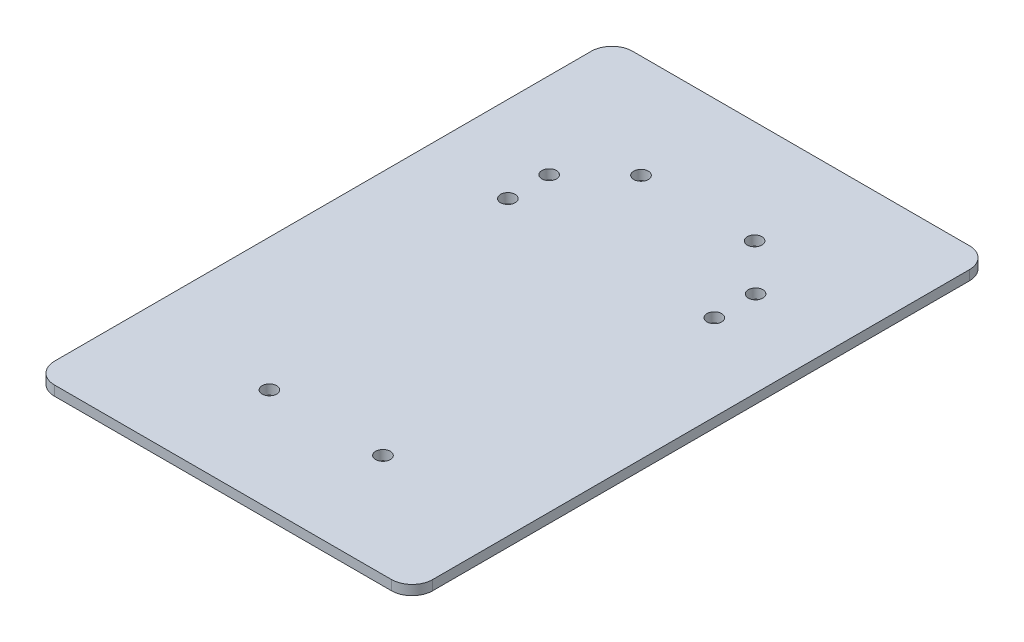
ISO-10303-21;
HEADER;
FILE_DESCRIPTION(('STEP AP214'),'2;1');
FILE_NAME('part.step','',(''),(''),'','','');
FILE_SCHEMA(('AUTOMOTIVE_DESIGN { 1 0 10303 214 1 1 1 1 }'));
ENDSEC;
DATA;
#1=APPLICATION_CONTEXT('core data for automotive mechanical design processes');
#2=APPLICATION_PROTOCOL_DEFINITION('international standard','automotive_design',2000,#1);
#3=PRODUCT_CONTEXT('',#1,'mechanical');
#4=PRODUCT('Part','Part','',(#3));
#5=PRODUCT_RELATED_PRODUCT_CATEGORY('part','',(#4));
#6=PRODUCT_DEFINITION_FORMATION('','',#4);
#7=PRODUCT_DEFINITION_CONTEXT('part definition',#1,'design');
#8=PRODUCT_DEFINITION('design','',#6,#7);
#9=PRODUCT_DEFINITION_SHAPE('','',#8);
#10=(LENGTH_UNIT() NAMED_UNIT(*) SI_UNIT(.MILLI.,.METRE.));
#11=(NAMED_UNIT(*) PLANE_ANGLE_UNIT() SI_UNIT($,.RADIAN.));
#12=(NAMED_UNIT(*) SI_UNIT($,.STERADIAN.) SOLID_ANGLE_UNIT());
#13=UNCERTAINTY_MEASURE_WITH_UNIT(LENGTH_MEASURE(1.E-05),#10,'distance_accuracy_value','');
#14=(GEOMETRIC_REPRESENTATION_CONTEXT(3) GLOBAL_UNCERTAINTY_ASSIGNED_CONTEXT((#13)) GLOBAL_UNIT_ASSIGNED_CONTEXT((#10,
#11,#12)) REPRESENTATION_CONTEXT('',''));
#15=CARTESIAN_POINT('',(0.,0.,0.));
#16=DIRECTION('',(0.,0.,1.));
#17=DIRECTION('',(1.,0.,0.));
#18=AXIS2_PLACEMENT_3D('',#15,#16,#17);
#19=CARTESIAN_POINT('',(0.,3.,0.));
#20=DIRECTION('',(0.,0.,-1.));
#21=DIRECTION('',(-1.,0.,0.));
#22=AXIS2_PLACEMENT_3D('',#19,#20,#21);
#23=PLANE('',#22);
#24=DIRECTION('',(1.,0.,0.));
#25=VECTOR('',#24,1.);
#26=CARTESIAN_POINT('',(0.,3.,0.));
#27=LINE('',#26,#25);
#28=CARTESIAN_POINT('',(6.35,3.,0.));
#29=VERTEX_POINT('',#28);
#30=CARTESIAN_POINT('',(109.982,3.,0.));
#31=VERTEX_POINT('',#30);
#32=EDGE_CURVE('E170',#29,#31,#27,.T.);
#33=ORIENTED_EDGE('',*,*,#32,.T.);
#34=DIRECTION('',(0.,-1.,0.));
#35=VECTOR('',#34,1.);
#36=CARTESIAN_POINT('',(109.982,0.,0.));
#37=LINE('',#36,#35);
#38=CARTESIAN_POINT('',(109.982,0.,0.));
#39=VERTEX_POINT('',#38);
#40=EDGE_CURVE('E12',#31,#39,#37,.T.);
#41=ORIENTED_EDGE('',*,*,#40,.T.);
#42=DIRECTION('',(1.,0.,0.));
#43=VECTOR('',#42,1.);
#44=CARTESIAN_POINT('',(0.,0.,0.));
#45=LINE('',#44,#43);
#46=CARTESIAN_POINT('',(6.35,0.,0.));
#47=VERTEX_POINT('',#46);
#48=EDGE_CURVE('E172',#47,#39,#45,.T.);
#49=ORIENTED_EDGE('',*,*,#48,.F.);
#50=DIRECTION('',(0.,-1.,0.));
#51=VECTOR('',#50,1.);
#52=CARTESIAN_POINT('',(6.35,3.,0.));
#53=LINE('',#52,#51);
#54=EDGE_CURVE('E83',#47,#29,#53,.F.);
#55=ORIENTED_EDGE('',*,*,#54,.T.);
#56=EDGE_LOOP('',(#33,#41,#49,#55));
#57=FACE_BOUND('',#56,.T.);
#58=ADVANCED_FACE('F75',(#57),#23,.T.);
#59=CARTESIAN_POINT('',(0.,3.,0.));
#60=DIRECTION('',(1.,0.,0.));
#61=DIRECTION('',(0.,0.,-1.));
#62=AXIS2_PLACEMENT_3D('',#59,#60,#61);
#63=PLANE('',#62);
#64=DIRECTION('',(0.,0.,1.));
#65=VECTOR('',#64,1.);
#66=CARTESIAN_POINT('',(0.,0.,0.));
#67=LINE('',#66,#65);
#68=CARTESIAN_POINT('',(0.,0.,6.35));
#69=VERTEX_POINT('',#68);
#70=CARTESIAN_POINT('',(0.,0.,171.45));
#71=VERTEX_POINT('',#70);
#72=EDGE_CURVE('E168',#69,#71,#67,.T.);
#73=ORIENTED_EDGE('',*,*,#72,.T.);
#74=DIRECTION('',(0.,-1.,0.));
#75=VECTOR('',#74,1.);
#76=CARTESIAN_POINT('',(0.,3.,171.45));
#77=LINE('',#76,#75);
#78=CARTESIAN_POINT('',(0.,3.,171.45));
#79=VERTEX_POINT('',#78);
#80=EDGE_CURVE('E147',#71,#79,#77,.F.);
#81=ORIENTED_EDGE('',*,*,#80,.T.);
#82=DIRECTION('',(0.,0.,1.));
#83=VECTOR('',#82,1.);
#84=CARTESIAN_POINT('',(0.,3.,0.));
#85=LINE('',#84,#83);
#86=CARTESIAN_POINT('',(0.,3.,6.35));
#87=VERTEX_POINT('',#86);
#88=EDGE_CURVE('E221',#87,#79,#85,.T.);
#89=ORIENTED_EDGE('',*,*,#88,.F.);
#90=DIRECTION('',(0.,-1.,0.));
#91=VECTOR('',#90,1.);
#92=CARTESIAN_POINT('',(0.,0.,6.35));
#93=LINE('',#92,#91);
#94=EDGE_CURVE('E152',#87,#69,#93,.T.);
#95=ORIENTED_EDGE('',*,*,#94,.T.);
#96=EDGE_LOOP('',(#73,#81,#89,#95));
#97=FACE_BOUND('',#96,.T.);
#98=ADVANCED_FACE('F225',(#97),#63,.F.);
#99=CARTESIAN_POINT('',(0.,3.,177.8));
#100=DIRECTION('',(0.,0.,-1.));
#101=DIRECTION('',(-1.,0.,0.));
#102=AXIS2_PLACEMENT_3D('',#99,#100,#101);
#103=PLANE('',#102);
#104=DIRECTION('',(1.,0.,0.));
#105=VECTOR('',#104,1.);
#106=CARTESIAN_POINT('',(0.,3.,177.8));
#107=LINE('',#106,#105);
#108=CARTESIAN_POINT('',(6.35000000000002,3.,177.8));
#109=VERTEX_POINT('',#108);
#110=CARTESIAN_POINT('',(109.982,3.,177.8));
#111=VERTEX_POINT('',#110);
#112=EDGE_CURVE('E161',#109,#111,#107,.T.);
#113=ORIENTED_EDGE('',*,*,#112,.F.);
#114=DIRECTION('',(0.,-1.,0.));
#115=VECTOR('',#114,1.);
#116=CARTESIAN_POINT('',(6.35000000000002,3.,177.8));
#117=LINE('',#116,#115);
#118=CARTESIAN_POINT('',(6.35000000000002,0.,177.8));
#119=VERTEX_POINT('',#118);
#120=EDGE_CURVE('E146',#109,#119,#117,.T.);
#121=ORIENTED_EDGE('',*,*,#120,.T.);
#122=DIRECTION('',(1.,0.,0.));
#123=VECTOR('',#122,1.);
#124=CARTESIAN_POINT('',(0.,0.,177.8));
#125=LINE('',#124,#123);
#126=CARTESIAN_POINT('',(109.982,0.,177.8));
#127=VERTEX_POINT('',#126);
#128=EDGE_CURVE('E159',#119,#127,#125,.T.);
#129=ORIENTED_EDGE('',*,*,#128,.T.);
#130=DIRECTION('',(0.,-1.,0.));
#131=VECTOR('',#130,1.);
#132=CARTESIAN_POINT('',(109.982,3.,177.8));
#133=LINE('',#132,#131);
#134=EDGE_CURVE('E163',#127,#111,#133,.F.);
#135=ORIENTED_EDGE('',*,*,#134,.T.);
#136=EDGE_LOOP('',(#113,#121,#129,#135));
#137=FACE_BOUND('',#136,.T.);
#138=ADVANCED_FACE('F158',(#137),#103,.F.);
#139=CARTESIAN_POINT('',(116.332,3.,0.));
#140=DIRECTION('',(-1.,0.,0.));
#141=DIRECTION('',(0.,0.,1.));
#142=AXIS2_PLACEMENT_3D('',#139,#140,#141);
#143=PLANE('',#142);
#144=DIRECTION('',(0.,0.,-1.));
#145=VECTOR('',#144,1.);
#146=CARTESIAN_POINT('',(116.332,3.,0.));
#147=LINE('',#146,#145);
#148=CARTESIAN_POINT('',(116.332,3.,171.45));
#149=VERTEX_POINT('',#148);
#150=CARTESIAN_POINT('',(116.332,3.,6.35));
#151=VERTEX_POINT('',#150);
#152=EDGE_CURVE('E189',#149,#151,#147,.T.);
#153=ORIENTED_EDGE('',*,*,#152,.F.);
#154=DIRECTION('',(0.,-1.,0.));
#155=VECTOR('',#154,1.);
#156=CARTESIAN_POINT('',(116.332,3.,171.45));
#157=LINE('',#156,#155);
#158=CARTESIAN_POINT('',(116.332,0.,171.45));
#159=VERTEX_POINT('',#158);
#160=EDGE_CURVE('E206',#149,#159,#157,.T.);
#161=ORIENTED_EDGE('',*,*,#160,.T.);
#162=DIRECTION('',(0.,0.,-1.));
#163=VECTOR('',#162,1.);
#164=CARTESIAN_POINT('',(116.332,0.,0.));
#165=LINE('',#164,#163);
#166=CARTESIAN_POINT('',(116.332,0.,6.35));
#167=VERTEX_POINT('',#166);
#168=EDGE_CURVE('E167',#159,#167,#165,.T.);
#169=ORIENTED_EDGE('',*,*,#168,.T.);
#170=DIRECTION('',(0.,-1.,0.));
#171=VECTOR('',#170,1.);
#172=CARTESIAN_POINT('',(116.332,3.,6.35));
#173=LINE('',#172,#171);
#174=EDGE_CURVE('E90',#167,#151,#173,.F.);
#175=ORIENTED_EDGE('',*,*,#174,.T.);
#176=EDGE_LOOP('',(#153,#161,#169,#175));
#177=FACE_BOUND('',#176,.T.);
#178=ADVANCED_FACE('F290',(#177),#143,.F.);
#179=CARTESIAN_POINT('',(0.,0.,0.));
#180=DIRECTION('',(0.,1.,0.));
#181=DIRECTION('',(0.,0.,1.));
#182=AXIS2_PLACEMENT_3D('',#179,#180,#181);
#183=PLANE('',#182);
#184=CARTESIAN_POINT('',(75.6285,0.,31.75));
#185=DIRECTION('',(0.,1.,0.));
#186=DIRECTION('',(0.,0.,1.));
#187=AXIS2_PLACEMENT_3D('',#184,#185,#186);
#188=CIRCLE('',#187,2.24999999999998);
#189=CARTESIAN_POINT('',(75.6285,0.,34.));
#190=VERTEX_POINT('',#189);
#191=EDGE_CURVE('E255',#190,#190,#188,.T.);
#192=ORIENTED_EDGE('',*,*,#191,.T.);
#193=EDGE_LOOP('',(#192));
#194=FACE_BOUND('',#193,.T.);
#195=CARTESIAN_POINT('',(40.7035,0.,146.05));
#196=DIRECTION('',(0.,1.,0.));
#197=DIRECTION('',(0.,0.,1.));
#198=AXIS2_PLACEMENT_3D('',#195,#196,#197);
#199=CIRCLE('',#198,2.25);
#200=CARTESIAN_POINT('',(40.7035,0.,148.3));
#201=VERTEX_POINT('',#200);
#202=EDGE_CURVE('E248',#201,#201,#199,.T.);
#203=ORIENTED_EDGE('',*,*,#202,.T.);
#204=EDGE_LOOP('',(#203));
#205=FACE_BOUND('',#204,.T.);
#206=CARTESIAN_POINT('',(75.6285,0.,146.05));
#207=DIRECTION('',(0.,1.,0.));
#208=DIRECTION('',(0.,0.,1.));
#209=AXIS2_PLACEMENT_3D('',#206,#207,#208);
#210=CIRCLE('',#209,2.25);
#211=CARTESIAN_POINT('',(75.6285,0.,148.3));
#212=VERTEX_POINT('',#211);
#213=EDGE_CURVE('E260',#212,#212,#210,.T.);
#214=ORIENTED_EDGE('',*,*,#213,.T.);
#215=EDGE_LOOP('',(#214));
#216=FACE_BOUND('',#215,.T.);
#217=CARTESIAN_POINT('',(40.7035,0.,31.75));
#218=DIRECTION('',(0.,1.,0.));
#219=DIRECTION('',(0.,0.,1.));
#220=AXIS2_PLACEMENT_3D('',#217,#218,#219);
#221=CIRCLE('',#220,2.25);
#222=CARTESIAN_POINT('',(40.7035,0.,34.));
#223=VERTEX_POINT('',#222);
#224=EDGE_CURVE('E241',#223,#223,#221,.T.);
#225=ORIENTED_EDGE('',*,*,#224,.T.);
#226=EDGE_LOOP('',(#225));
#227=FACE_BOUND('',#226,.T.);
#228=CARTESIAN_POINT('',(26.416,0.,58.42));
#229=DIRECTION('',(0.,1.,0.));
#230=DIRECTION('',(0.,0.,1.));
#231=AXIS2_PLACEMENT_3D('',#228,#229,#230);
#232=CIRCLE('',#231,2.25);
#233=CARTESIAN_POINT('',(26.416,0.,60.67));
#234=VERTEX_POINT('',#233);
#235=EDGE_CURVE('E232',#234,#234,#232,.T.);
#236=ORIENTED_EDGE('',*,*,#235,.T.);
#237=EDGE_LOOP('',(#236));
#238=FACE_BOUND('',#237,.T.);
#239=CARTESIAN_POINT('',(89.916,0.,45.72));
#240=DIRECTION('',(0.,1.,0.));
#241=DIRECTION('',(0.,0.,1.));
#242=AXIS2_PLACEMENT_3D('',#239,#240,#241);
#243=CIRCLE('',#242,2.25);
#244=CARTESIAN_POINT('',(89.916,0.,47.97));
#245=VERTEX_POINT('',#244);
#246=EDGE_CURVE('E233',#245,#245,#243,.T.);
#247=ORIENTED_EDGE('',*,*,#246,.T.);
#248=EDGE_LOOP('',(#247));
#249=FACE_BOUND('',#248,.T.);
#250=CARTESIAN_POINT('',(89.916,0.,58.42));
#251=DIRECTION('',(0.,1.,0.));
#252=DIRECTION('',(0.,0.,1.));
#253=AXIS2_PLACEMENT_3D('',#250,#251,#252);
#254=CIRCLE('',#253,2.25);
#255=CARTESIAN_POINT('',(89.916,0.,60.67));
#256=VERTEX_POINT('',#255);
#257=EDGE_CURVE('E236',#256,#256,#254,.T.);
#258=ORIENTED_EDGE('',*,*,#257,.T.);
#259=EDGE_LOOP('',(#258));
#260=FACE_BOUND('',#259,.T.);
#261=CARTESIAN_POINT('',(26.416,0.,45.72));
#262=DIRECTION('',(0.,1.,0.));
#263=DIRECTION('',(0.,0.,1.));
#264=AXIS2_PLACEMENT_3D('',#261,#262,#263);
#265=CIRCLE('',#264,2.25);
#266=CARTESIAN_POINT('',(26.416,0.,47.97));
#267=VERTEX_POINT('',#266);
#268=EDGE_CURVE('E180',#267,#267,#265,.T.);
#269=ORIENTED_EDGE('',*,*,#268,.T.);
#270=EDGE_LOOP('',(#269));
#271=FACE_BOUND('',#270,.T.);
#272=ORIENTED_EDGE('',*,*,#128,.F.);
#273=CARTESIAN_POINT('',(6.35000000000002,0.,171.45));
#274=DIRECTION('',(0.,1.,0.));
#275=DIRECTION('',(0.,0.,1.));
#276=AXIS2_PLACEMENT_3D('',#273,#274,#275);
#277=CIRCLE('',#276,6.35);
#278=EDGE_CURVE('E142',#119,#71,#277,.F.);
#279=ORIENTED_EDGE('',*,*,#278,.T.);
#280=ORIENTED_EDGE('',*,*,#72,.F.);
#281=CARTESIAN_POINT('',(6.35,0.,6.35));
#282=DIRECTION('',(0.,1.,0.));
#283=DIRECTION('',(0.,0.,1.));
#284=AXIS2_PLACEMENT_3D('',#281,#282,#283);
#285=CIRCLE('',#284,6.35);
#286=EDGE_CURVE('E162',#69,#47,#285,.F.);
#287=ORIENTED_EDGE('',*,*,#286,.T.);
#288=ORIENTED_EDGE('',*,*,#48,.T.);
#289=CARTESIAN_POINT('',(109.982,0.,6.35));
#290=DIRECTION('',(0.,1.,0.));
#291=DIRECTION('',(0.,0.,1.));
#292=AXIS2_PLACEMENT_3D('',#289,#290,#291);
#293=CIRCLE('',#292,6.35);
#294=EDGE_CURVE('E192',#39,#167,#293,.F.);
#295=ORIENTED_EDGE('',*,*,#294,.T.);
#296=ORIENTED_EDGE('',*,*,#168,.F.);
#297=CARTESIAN_POINT('',(109.982,0.,171.45));
#298=DIRECTION('',(0.,1.,0.));
#299=DIRECTION('',(0.,0.,1.));
#300=AXIS2_PLACEMENT_3D('',#297,#298,#299);
#301=CIRCLE('',#300,6.35);
#302=EDGE_CURVE('E153',#159,#127,#301,.F.);
#303=ORIENTED_EDGE('',*,*,#302,.T.);
#304=EDGE_LOOP('',(#272,#279,#280,#287,#288,#295,#296,#303));
#305=FACE_BOUND('',#304,.T.);
#306=ADVANCED_FACE('F165',(#194,#205,#216,#227,#238,#249,#260,#271,#305),#183,.F.);
#307=CARTESIAN_POINT('',(0.,3.,0.));
#308=DIRECTION('',(0.,1.,0.));
#309=DIRECTION('',(0.,0.,1.));
#310=AXIS2_PLACEMENT_3D('',#307,#308,#309);
#311=PLANE('',#310);
#312=CARTESIAN_POINT('',(75.6285,3.,31.75));
#313=DIRECTION('',(0.,1.,0.));
#314=DIRECTION('',(0.,0.,1.));
#315=AXIS2_PLACEMENT_3D('',#312,#313,#314);
#316=CIRCLE('',#315,2.24999999999998);
#317=CARTESIAN_POINT('',(75.6285,3.,34.));
#318=VERTEX_POINT('',#317);
#319=EDGE_CURVE('E245',#318,#318,#316,.T.);
#320=ORIENTED_EDGE('',*,*,#319,.F.);
#321=EDGE_LOOP('',(#320));
#322=FACE_BOUND('',#321,.T.);
#323=CARTESIAN_POINT('',(40.7035,3.,146.05));
#324=DIRECTION('',(0.,1.,0.));
#325=DIRECTION('',(0.,0.,1.));
#326=AXIS2_PLACEMENT_3D('',#323,#324,#325);
#327=CIRCLE('',#326,2.25);
#328=CARTESIAN_POINT('',(40.7035,3.,148.3));
#329=VERTEX_POINT('',#328);
#330=EDGE_CURVE('E251',#329,#329,#327,.T.);
#331=ORIENTED_EDGE('',*,*,#330,.F.);
#332=EDGE_LOOP('',(#331));
#333=FACE_BOUND('',#332,.T.);
#334=CARTESIAN_POINT('',(75.6285,3.,146.05));
#335=DIRECTION('',(0.,1.,0.));
#336=DIRECTION('',(0.,0.,1.));
#337=AXIS2_PLACEMENT_3D('',#334,#335,#336);
#338=CIRCLE('',#337,2.25);
#339=CARTESIAN_POINT('',(75.6285,3.,148.3));
#340=VERTEX_POINT('',#339);
#341=EDGE_CURVE('E252',#340,#340,#338,.T.);
#342=ORIENTED_EDGE('',*,*,#341,.F.);
#343=EDGE_LOOP('',(#342));
#344=FACE_BOUND('',#343,.T.);
#345=CARTESIAN_POINT('',(40.7035,3.,31.75));
#346=DIRECTION('',(0.,1.,0.));
#347=DIRECTION('',(0.,0.,1.));
#348=AXIS2_PLACEMENT_3D('',#345,#346,#347);
#349=CIRCLE('',#348,2.25);
#350=CARTESIAN_POINT('',(40.7035,3.,34.));
#351=VERTEX_POINT('',#350);
#352=EDGE_CURVE('E242',#351,#351,#349,.T.);
#353=ORIENTED_EDGE('',*,*,#352,.F.);
#354=EDGE_LOOP('',(#353));
#355=FACE_BOUND('',#354,.T.);
#356=CARTESIAN_POINT('',(26.416,3.,58.42));
#357=DIRECTION('',(0.,1.,0.));
#358=DIRECTION('',(0.,0.,1.));
#359=AXIS2_PLACEMENT_3D('',#356,#357,#358);
#360=CIRCLE('',#359,2.25);
#361=CARTESIAN_POINT('',(26.416,3.,60.67));
#362=VERTEX_POINT('',#361);
#363=EDGE_CURVE('E186',#362,#362,#360,.T.);
#364=ORIENTED_EDGE('',*,*,#363,.F.);
#365=EDGE_LOOP('',(#364));
#366=FACE_BOUND('',#365,.T.);
#367=CARTESIAN_POINT('',(89.916,3.,45.72));
#368=DIRECTION('',(0.,1.,0.));
#369=DIRECTION('',(0.,0.,1.));
#370=AXIS2_PLACEMENT_3D('',#367,#368,#369);
#371=CIRCLE('',#370,2.25);
#372=CARTESIAN_POINT('',(89.916,3.,47.97));
#373=VERTEX_POINT('',#372);
#374=EDGE_CURVE('E183',#373,#373,#371,.T.);
#375=ORIENTED_EDGE('',*,*,#374,.F.);
#376=EDGE_LOOP('',(#375));
#377=FACE_BOUND('',#376,.T.);
#378=CARTESIAN_POINT('',(89.916,3.,58.42));
#379=DIRECTION('',(0.,1.,0.));
#380=DIRECTION('',(0.,0.,1.));
#381=AXIS2_PLACEMENT_3D('',#378,#379,#380);
#382=CIRCLE('',#381,2.25);
#383=CARTESIAN_POINT('',(89.916,3.,60.67));
#384=VERTEX_POINT('',#383);
#385=EDGE_CURVE('E179',#384,#384,#382,.T.);
#386=ORIENTED_EDGE('',*,*,#385,.F.);
#387=EDGE_LOOP('',(#386));
#388=FACE_BOUND('',#387,.T.);
#389=CARTESIAN_POINT('',(26.416,3.,45.72));
#390=DIRECTION('',(0.,1.,0.));
#391=DIRECTION('',(0.,0.,1.));
#392=AXIS2_PLACEMENT_3D('',#389,#390,#391);
#393=CIRCLE('',#392,2.25);
#394=CARTESIAN_POINT('',(26.416,3.,47.97));
#395=VERTEX_POINT('',#394);
#396=EDGE_CURVE('E176',#395,#395,#393,.T.);
#397=ORIENTED_EDGE('',*,*,#396,.F.);
#398=EDGE_LOOP('',(#397));
#399=FACE_BOUND('',#398,.T.);
#400=ORIENTED_EDGE('',*,*,#88,.T.);
#401=CARTESIAN_POINT('',(6.35000000000002,3.,171.45));
#402=DIRECTION('',(0.,1.,0.));
#403=DIRECTION('',(0.,0.,1.));
#404=AXIS2_PLACEMENT_3D('',#401,#402,#403);
#405=CIRCLE('',#404,6.35);
#406=EDGE_CURVE('E203',#79,#109,#405,.T.);
#407=ORIENTED_EDGE('',*,*,#406,.T.);
#408=ORIENTED_EDGE('',*,*,#112,.T.);
#409=CARTESIAN_POINT('',(109.982,3.,171.45));
#410=DIRECTION('',(0.,1.,0.));
#411=DIRECTION('',(0.,0.,1.));
#412=AXIS2_PLACEMENT_3D('',#409,#410,#411);
#413=CIRCLE('',#412,6.35);
#414=EDGE_CURVE('E97',#111,#149,#413,.T.);
#415=ORIENTED_EDGE('',*,*,#414,.T.);
#416=ORIENTED_EDGE('',*,*,#152,.T.);
#417=CARTESIAN_POINT('',(109.982,3.,6.35));
#418=DIRECTION('',(0.,1.,0.));
#419=DIRECTION('',(0.,0.,1.));
#420=AXIS2_PLACEMENT_3D('',#417,#418,#419);
#421=CIRCLE('',#420,6.35);
#422=EDGE_CURVE('E200',#151,#31,#421,.T.);
#423=ORIENTED_EDGE('',*,*,#422,.T.);
#424=ORIENTED_EDGE('',*,*,#32,.F.);
#425=CARTESIAN_POINT('',(6.35,3.,6.35));
#426=DIRECTION('',(0.,1.,0.));
#427=DIRECTION('',(0.,0.,1.));
#428=AXIS2_PLACEMENT_3D('',#425,#426,#427);
#429=CIRCLE('',#428,6.35);
#430=EDGE_CURVE('E198',#29,#87,#429,.T.);
#431=ORIENTED_EDGE('',*,*,#430,.T.);
#432=EDGE_LOOP('',(#400,#407,#408,#415,#416,#423,#424,#431));
#433=FACE_BOUND('',#432,.T.);
#434=ADVANCED_FACE('F218',(#322,#333,#344,#355,#366,#377,#388,#399,#433),#311,.T.);
#435=CARTESIAN_POINT('',(26.416,0.,45.72));
#436=DIRECTION('',(0.,1.,0.));
#437=DIRECTION('',(0.,0.,1.));
#438=AXIS2_PLACEMENT_3D('',#435,#436,#437);
#439=CYLINDRICAL_SURFACE('',#438,2.25);
#440=ORIENTED_EDGE('',*,*,#396,.T.);
#441=EDGE_LOOP('',(#440));
#442=FACE_BOUND('',#441,.T.);
#443=ORIENTED_EDGE('',*,*,#268,.F.);
#444=EDGE_LOOP('',(#443));
#445=FACE_BOUND('',#444,.T.);
#446=ADVANCED_FACE('F270',(#442,#445),#439,.F.);
#447=CARTESIAN_POINT('',(89.916,0.,58.42));
#448=DIRECTION('',(0.,1.,0.));
#449=DIRECTION('',(0.,0.,1.));
#450=AXIS2_PLACEMENT_3D('',#447,#448,#449);
#451=CYLINDRICAL_SURFACE('',#450,2.25);
#452=ORIENTED_EDGE('',*,*,#385,.T.);
#453=EDGE_LOOP('',(#452));
#454=FACE_BOUND('',#453,.T.);
#455=ORIENTED_EDGE('',*,*,#257,.F.);
#456=EDGE_LOOP('',(#455));
#457=FACE_BOUND('',#456,.T.);
#458=ADVANCED_FACE('F285',(#454,#457),#451,.F.);
#459=CARTESIAN_POINT('',(89.916,0.,45.72));
#460=DIRECTION('',(0.,1.,0.));
#461=DIRECTION('',(0.,0.,1.));
#462=AXIS2_PLACEMENT_3D('',#459,#460,#461);
#463=CYLINDRICAL_SURFACE('',#462,2.25);
#464=ORIENTED_EDGE('',*,*,#374,.T.);
#465=EDGE_LOOP('',(#464));
#466=FACE_BOUND('',#465,.T.);
#467=ORIENTED_EDGE('',*,*,#246,.F.);
#468=EDGE_LOOP('',(#467));
#469=FACE_BOUND('',#468,.T.);
#470=ADVANCED_FACE('F437',(#466,#469),#463,.F.);
#471=CARTESIAN_POINT('',(26.416,0.,58.42));
#472=DIRECTION('',(0.,1.,0.));
#473=DIRECTION('',(0.,0.,1.));
#474=AXIS2_PLACEMENT_3D('',#471,#472,#473);
#475=CYLINDRICAL_SURFACE('',#474,2.25);
#476=ORIENTED_EDGE('',*,*,#363,.T.);
#477=EDGE_LOOP('',(#476));
#478=FACE_BOUND('',#477,.T.);
#479=ORIENTED_EDGE('',*,*,#235,.F.);
#480=EDGE_LOOP('',(#479));
#481=FACE_BOUND('',#480,.T.);
#482=ADVANCED_FACE('F426',(#478,#481),#475,.F.);
#483=CARTESIAN_POINT('',(40.7035,0.,31.75));
#484=DIRECTION('',(0.,1.,0.));
#485=DIRECTION('',(0.,0.,1.));
#486=AXIS2_PLACEMENT_3D('',#483,#484,#485);
#487=CYLINDRICAL_SURFACE('',#486,2.25);
#488=ORIENTED_EDGE('',*,*,#224,.F.);
#489=EDGE_LOOP('',(#488));
#490=FACE_BOUND('',#489,.T.);
#491=ORIENTED_EDGE('',*,*,#352,.T.);
#492=EDGE_LOOP('',(#491));
#493=FACE_BOUND('',#492,.T.);
#494=ADVANCED_FACE('F415',(#490,#493),#487,.F.);
#495=CARTESIAN_POINT('',(75.6285,0.,146.05));
#496=DIRECTION('',(0.,1.,0.));
#497=DIRECTION('',(0.,0.,1.));
#498=AXIS2_PLACEMENT_3D('',#495,#496,#497);
#499=CYLINDRICAL_SURFACE('',#498,2.25);
#500=ORIENTED_EDGE('',*,*,#213,.F.);
#501=EDGE_LOOP('',(#500));
#502=FACE_BOUND('',#501,.T.);
#503=ORIENTED_EDGE('',*,*,#341,.T.);
#504=EDGE_LOOP('',(#503));
#505=FACE_BOUND('',#504,.T.);
#506=ADVANCED_FACE('F266',(#502,#505),#499,.F.);
#507=CARTESIAN_POINT('',(40.7035,0.,146.05));
#508=DIRECTION('',(0.,1.,0.));
#509=DIRECTION('',(0.,0.,1.));
#510=AXIS2_PLACEMENT_3D('',#507,#508,#509);
#511=CYLINDRICAL_SURFACE('',#510,2.25);
#512=ORIENTED_EDGE('',*,*,#202,.F.);
#513=EDGE_LOOP('',(#512));
#514=FACE_BOUND('',#513,.T.);
#515=ORIENTED_EDGE('',*,*,#330,.T.);
#516=EDGE_LOOP('',(#515));
#517=FACE_BOUND('',#516,.T.);
#518=ADVANCED_FACE('F394',(#514,#517),#511,.F.);
#519=CARTESIAN_POINT('',(75.6285,0.,31.75));
#520=DIRECTION('',(0.,1.,0.));
#521=DIRECTION('',(0.,0.,1.));
#522=AXIS2_PLACEMENT_3D('',#519,#520,#521);
#523=CYLINDRICAL_SURFACE('',#522,2.24999999999998);
#524=ORIENTED_EDGE('',*,*,#191,.F.);
#525=EDGE_LOOP('',(#524));
#526=FACE_BOUND('',#525,.T.);
#527=ORIENTED_EDGE('',*,*,#319,.T.);
#528=EDGE_LOOP('',(#527));
#529=FACE_BOUND('',#528,.T.);
#530=ADVANCED_FACE('F309',(#526,#529),#523,.F.);
#531=CARTESIAN_POINT('',(6.35000000000002,3.,171.45));
#532=DIRECTION('',(0.,-1.,0.));
#533=DIRECTION('',(0.,0.,-1.));
#534=AXIS2_PLACEMENT_3D('',#531,#532,#533);
#535=CYLINDRICAL_SURFACE('',#534,6.35);
#536=ORIENTED_EDGE('',*,*,#406,.F.);
#537=ORIENTED_EDGE('',*,*,#80,.F.);
#538=ORIENTED_EDGE('',*,*,#278,.F.);
#539=ORIENTED_EDGE('',*,*,#120,.F.);
#540=EDGE_LOOP('',(#536,#537,#538,#539));
#541=FACE_BOUND('',#540,.T.);
#542=ADVANCED_FACE('F145',(#541),#535,.T.);
#543=CARTESIAN_POINT('',(109.982,3.,171.45));
#544=DIRECTION('',(0.,-1.,0.));
#545=DIRECTION('',(0.,0.,-1.));
#546=AXIS2_PLACEMENT_3D('',#543,#544,#545);
#547=CYLINDRICAL_SURFACE('',#546,6.35);
#548=ORIENTED_EDGE('',*,*,#414,.F.);
#549=ORIENTED_EDGE('',*,*,#134,.F.);
#550=ORIENTED_EDGE('',*,*,#302,.F.);
#551=ORIENTED_EDGE('',*,*,#160,.F.);
#552=EDGE_LOOP('',(#548,#549,#550,#551));
#553=FACE_BOUND('',#552,.T.);
#554=ADVANCED_FACE('F308',(#553),#547,.T.);
#555=CARTESIAN_POINT('',(109.982,3.,6.35));
#556=DIRECTION('',(0.,1.,0.));
#557=DIRECTION('',(0.,0.,1.));
#558=AXIS2_PLACEMENT_3D('',#555,#556,#557);
#559=CYLINDRICAL_SURFACE('',#558,6.35);
#560=ORIENTED_EDGE('',*,*,#422,.F.);
#561=ORIENTED_EDGE('',*,*,#174,.F.);
#562=ORIENTED_EDGE('',*,*,#294,.F.);
#563=ORIENTED_EDGE('',*,*,#40,.F.);
#564=EDGE_LOOP('',(#560,#561,#562,#563));
#565=FACE_BOUND('',#564,.T.);
#566=ADVANCED_FACE('F311',(#565),#559,.T.);
#567=CARTESIAN_POINT('',(6.35,3.,6.35));
#568=DIRECTION('',(0.,1.,0.));
#569=DIRECTION('',(0.,0.,1.));
#570=AXIS2_PLACEMENT_3D('',#567,#568,#569);
#571=CYLINDRICAL_SURFACE('',#570,6.35);
#572=ORIENTED_EDGE('',*,*,#430,.F.);
#573=ORIENTED_EDGE('',*,*,#54,.F.);
#574=ORIENTED_EDGE('',*,*,#286,.F.);
#575=ORIENTED_EDGE('',*,*,#94,.F.);
#576=EDGE_LOOP('',(#572,#573,#574,#575));
#577=FACE_BOUND('',#576,.T.);
#578=ADVANCED_FACE('F77',(#577),#571,.T.);
#579=CLOSED_SHELL('',(#58,#98,#138,#178,#306,#434,#446,#458,#470,#482,#494,#506,#518,#530,#542,
#554,#566,#578));
#580=MANIFOLD_SOLID_BREP('B2',#579);
#581=ADVANCED_BREP_SHAPE_REPRESENTATION('',(#18,#580),#14);
#582=SHAPE_DEFINITION_REPRESENTATION(#9,#581);
ENDSEC;
END-ISO-10303-21;
